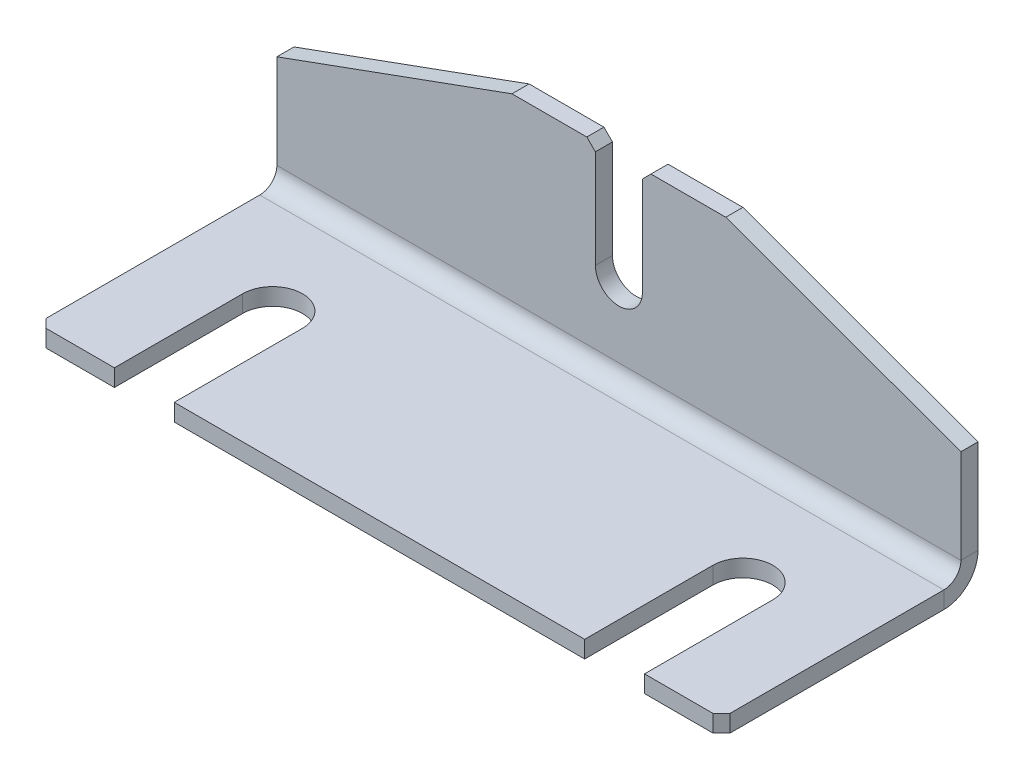
ISO-10303-21;
HEADER;
FILE_DESCRIPTION(('STEP AP214'),'2;1');
FILE_NAME('part.step','',(''),(''),'','','');
FILE_SCHEMA(('AUTOMOTIVE_DESIGN { 1 0 10303 214 1 1 1 1 }'));
ENDSEC;
DATA;
#1=APPLICATION_CONTEXT('core data for automotive mechanical design processes');
#2=APPLICATION_PROTOCOL_DEFINITION('international standard','automotive_design',2000,#1);
#3=PRODUCT_CONTEXT('',#1,'mechanical');
#4=PRODUCT('Part','Part','',(#3));
#5=PRODUCT_RELATED_PRODUCT_CATEGORY('part','',(#4));
#6=PRODUCT_DEFINITION_FORMATION('','',#4);
#7=PRODUCT_DEFINITION_CONTEXT('part definition',#1,'design');
#8=PRODUCT_DEFINITION('design','',#6,#7);
#9=PRODUCT_DEFINITION_SHAPE('','',#8);
#10=(LENGTH_UNIT() NAMED_UNIT(*) SI_UNIT(.MILLI.,.METRE.));
#11=(NAMED_UNIT(*) PLANE_ANGLE_UNIT() SI_UNIT($,.RADIAN.));
#12=(NAMED_UNIT(*) SI_UNIT($,.STERADIAN.) SOLID_ANGLE_UNIT());
#13=UNCERTAINTY_MEASURE_WITH_UNIT(LENGTH_MEASURE(1.E-05),#10,'distance_accuracy_value','');
#14=(GEOMETRIC_REPRESENTATION_CONTEXT(3) GLOBAL_UNCERTAINTY_ASSIGNED_CONTEXT((#13)) GLOBAL_UNIT_ASSIGNED_CONTEXT((#10,
#11,#12)) REPRESENTATION_CONTEXT('',''));
#15=CARTESIAN_POINT('',(0.,0.,0.));
#16=DIRECTION('',(0.,0.,1.));
#17=DIRECTION('',(1.,0.,0.));
#18=AXIS2_PLACEMENT_3D('',#15,#16,#17);
#19=CARTESIAN_POINT('',(-80.,46.,-30.0000000000002));
#20=DIRECTION('',(1.,0.,0.));
#21=DIRECTION('',(0.,0.,-1.));
#22=AXIS2_PLACEMENT_3D('',#19,#20,#21);
#23=PLANE('',#22);
#24=DIRECTION('',(0.,0.,1.));
#25=VECTOR('',#24,1.);
#26=CARTESIAN_POINT('',(-80.,26.,-30.0000000000002));
#27=LINE('',#26,#25);
#28=CARTESIAN_POINT('',(-80.,26.,-30.0000000000002));
#29=VERTEX_POINT('',#28);
#30=CARTESIAN_POINT('',(-80.,26.,-26.));
#31=VERTEX_POINT('',#30);
#32=EDGE_CURVE('E241',#29,#31,#27,.T.);
#33=ORIENTED_EDGE('',*,*,#32,.F.);
#34=DIRECTION('',(0.,1.,0.));
#35=VECTOR('',#34,1.);
#36=CARTESIAN_POINT('',(-80.,-1.18049333913981E-13,-30.));
#37=LINE('',#36,#35);
#38=CARTESIAN_POINT('',(-80.,4.00000000000002,-30.));
#39=VERTEX_POINT('',#38);
#40=EDGE_CURVE('E250',#39,#29,#37,.T.);
#41=ORIENTED_EDGE('',*,*,#40,.F.);
#42=DIRECTION('',(0.,0.,1.));
#43=VECTOR('',#42,1.);
#44=CARTESIAN_POINT('',(-80.,3.99999999999999,-26.));
#45=LINE('',#44,#43);
#46=CARTESIAN_POINT('',(-80.,3.99999999999995,-26.));
#47=VERTEX_POINT('',#46);
#48=EDGE_CURVE('E272',#47,#39,#45,.F.);
#49=ORIENTED_EDGE('',*,*,#48,.F.);
#50=DIRECTION('',(0.,-1.,0.));
#51=VECTOR('',#50,1.);
#52=CARTESIAN_POINT('',(-80.,46.,-26.0000000000002));
#53=LINE('',#52,#51);
#54=EDGE_CURVE('E266',#47,#31,#53,.F.);
#55=ORIENTED_EDGE('',*,*,#54,.T.);
#56=EDGE_LOOP('',(#33,#41,#49,#55));
#57=FACE_BOUND('',#56,.T.);
#58=ADVANCED_FACE('F61',(#57),#23,.F.);
#59=CARTESIAN_POINT('',(0.,-1.18049333913981E-13,-30.));
#60=DIRECTION('',(0.,0.,1.));
#61=DIRECTION('',(0.,-1.,0.));
#62=AXIS2_PLACEMENT_3D('',#59,#60,#61);
#63=PLANE('',#62);
#64=DIRECTION('',(1.,0.,0.));
#65=VECTOR('',#64,1.);
#66=CARTESIAN_POINT('',(0.,46.,-30.0000000000002));
#67=LINE('',#66,#65);
#68=CARTESIAN_POINT('',(-25.,46.,-30.0000000000002));
#69=VERTEX_POINT('',#68);
#70=CARTESIAN_POINT('',(-7.50000000000001,46.,-30.0000000000002));
#71=VERTEX_POINT('',#70);
#72=EDGE_CURVE('E246',#69,#71,#67,.T.);
#73=ORIENTED_EDGE('',*,*,#72,.T.);
#74=DIRECTION('',(0.707106781186546,-0.707106781186549,0.));
#75=VECTOR('',#74,1.);
#76=CARTESIAN_POINT('',(-5.5,44.,-30.0000000000003));
#77=LINE('',#76,#75);
#78=CARTESIAN_POINT('',(-5.5,44.,-30.0000000000002));
#79=VERTEX_POINT('',#78);
#80=EDGE_CURVE('E13',#71,#79,#77,.T.);
#81=ORIENTED_EDGE('',*,*,#80,.T.);
#82=DIRECTION('',(0.,1.,0.));
#83=VECTOR('',#82,1.);
#84=CARTESIAN_POINT('',(-5.5,0.,-30.0000000000002));
#85=LINE('',#84,#83);
#86=CARTESIAN_POINT('',(-5.5,21.,-30.0000000000002));
#87=VERTEX_POINT('',#86);
#88=EDGE_CURVE('E413',#87,#79,#85,.T.);
#89=ORIENTED_EDGE('',*,*,#88,.F.);
#90=CARTESIAN_POINT('',(0.,21.,-30.0000000000002));
#91=DIRECTION('',(0.,0.,1.));
#92=DIRECTION('',(1.,0.,0.));
#93=AXIS2_PLACEMENT_3D('',#90,#91,#92);
#94=CIRCLE('',#93,5.5);
#95=CARTESIAN_POINT('',(5.5,21.,-30.0000000000002));
#96=VERTEX_POINT('',#95);
#97=EDGE_CURVE('E527',#87,#96,#94,.T.);
#98=ORIENTED_EDGE('',*,*,#97,.T.);
#99=DIRECTION('',(0.,1.,0.));
#100=VECTOR('',#99,1.);
#101=CARTESIAN_POINT('',(5.5,0.,-30.0000000000002));
#102=LINE('',#101,#100);
#103=CARTESIAN_POINT('',(5.5,44.,-30.0000000000002));
#104=VERTEX_POINT('',#103);
#105=EDGE_CURVE('E427',#96,#104,#102,.T.);
#106=ORIENTED_EDGE('',*,*,#105,.T.);
#107=DIRECTION('',(-0.707106781186546,-0.707106781186549,0.));
#108=VECTOR('',#107,1.);
#109=CARTESIAN_POINT('',(7.50000000000001,46.,-30.0000000000002));
#110=LINE('',#109,#108);
#111=CARTESIAN_POINT('',(7.50000000000001,46.,-30.0000000000002));
#112=VERTEX_POINT('',#111);
#113=EDGE_CURVE('E400',#104,#112,#110,.F.);
#114=ORIENTED_EDGE('',*,*,#113,.T.);
#115=CARTESIAN_POINT('',(25.,46.,-30.0000000000002));
#116=VERTEX_POINT('',#115);
#117=EDGE_CURVE('E254',#112,#116,#67,.T.);
#118=ORIENTED_EDGE('',*,*,#117,.T.);
#119=DIRECTION('',(0.939793423488437,-0.341743063086704,0.));
#120=VECTOR('',#119,1.);
#121=CARTESIAN_POINT('',(17.6934306569343,48.6569343065693,-30.0000000000002));
#122=LINE('',#121,#120);
#123=CARTESIAN_POINT('',(80.,26.,-30.0000000000002));
#124=VERTEX_POINT('',#123);
#125=EDGE_CURVE('E436',#116,#124,#122,.T.);
#126=ORIENTED_EDGE('',*,*,#125,.T.);
#127=DIRECTION('',(0.,-1.,0.));
#128=VECTOR('',#127,1.);
#129=CARTESIAN_POINT('',(80.,-1.18049333913981E-13,-30.));
#130=LINE('',#129,#128);
#131=CARTESIAN_POINT('',(80.,3.99999999999993,-30.));
#132=VERTEX_POINT('',#131);
#133=EDGE_CURVE('E253',#124,#132,#130,.T.);
#134=ORIENTED_EDGE('',*,*,#133,.T.);
#135=DIRECTION('',(-1.,0.,0.));
#136=VECTOR('',#135,1.);
#137=CARTESIAN_POINT('',(80.,4.00000000000001,-30.));
#138=LINE('',#137,#136);
#139=EDGE_CURVE('E269',#39,#132,#138,.F.);
#140=ORIENTED_EDGE('',*,*,#139,.F.);
#141=ORIENTED_EDGE('',*,*,#40,.T.);
#142=DIRECTION('',(-0.939793423488437,-0.341743063086704,0.));
#143=VECTOR('',#142,1.);
#144=CARTESIAN_POINT('',(-17.6934306569343,48.6569343065693,-30.0000000000002));
#145=LINE('',#144,#143);
#146=EDGE_CURVE('E237',#69,#29,#145,.T.);
#147=ORIENTED_EDGE('',*,*,#146,.F.);
#148=EDGE_LOOP('',(#73,#81,#89,#98,#106,#114,#118,#126,#134,#140,#141,#147));
#149=FACE_BOUND('',#148,.T.);
#150=ADVANCED_FACE('F245',(#149),#63,.F.);
#151=CARTESIAN_POINT('',(0.,-1.04083408558608E-13,-26.));
#152=DIRECTION('',(0.,0.,1.));
#153=DIRECTION('',(0.,-1.,0.));
#154=AXIS2_PLACEMENT_3D('',#151,#152,#153);
#155=PLANE('',#154);
#156=DIRECTION('',(0.,1.,0.));
#157=VECTOR('',#156,1.);
#158=CARTESIAN_POINT('',(-5.5,0.,-26.));
#159=LINE('',#158,#157);
#160=CARTESIAN_POINT('',(-5.5,21.,-26.));
#161=VERTEX_POINT('',#160);
#162=CARTESIAN_POINT('',(-5.5,44.,-26.));
#163=VERTEX_POINT('',#162);
#164=EDGE_CURVE('E410',#161,#163,#159,.T.);
#165=ORIENTED_EDGE('',*,*,#164,.T.);
#166=DIRECTION('',(-0.707106781186546,0.707106781186549,0.));
#167=VECTOR('',#166,1.);
#168=CARTESIAN_POINT('',(19.25,19.2499999999998,-26.0000000000001));
#169=LINE('',#168,#167);
#170=CARTESIAN_POINT('',(-7.50000000000001,46.,-26.0000000000002));
#171=VERTEX_POINT('',#170);
#172=EDGE_CURVE('E84',#163,#171,#169,.T.);
#173=ORIENTED_EDGE('',*,*,#172,.T.);
#174=DIRECTION('',(-1.,0.,0.));
#175=VECTOR('',#174,1.);
#176=CARTESIAN_POINT('',(80.,46.,-26.0000000000002));
#177=LINE('',#176,#175);
#178=CARTESIAN_POINT('',(-25.,46.,-26.0000000000002));
#179=VERTEX_POINT('',#178);
#180=EDGE_CURVE('E263',#179,#171,#177,.F.);
#181=ORIENTED_EDGE('',*,*,#180,.F.);
#182=DIRECTION('',(-0.939793423488437,-0.341743063086704,0.));
#183=VECTOR('',#182,1.);
#184=CARTESIAN_POINT('',(-17.6934306569343,48.6569343065693,-26.));
#185=LINE('',#184,#183);
#186=EDGE_CURVE('E240',#179,#31,#185,.T.);
#187=ORIENTED_EDGE('',*,*,#186,.T.);
#188=ORIENTED_EDGE('',*,*,#54,.F.);
#189=DIRECTION('',(-1.,0.,0.));
#190=VECTOR('',#189,1.);
#191=CARTESIAN_POINT('',(80.,3.99999999999999,-26.));
#192=LINE('',#191,#190);
#193=CARTESIAN_POINT('',(80.,3.99999999999995,-26.));
#194=VERTEX_POINT('',#193);
#195=EDGE_CURVE('E275',#194,#47,#192,.T.);
#196=ORIENTED_EDGE('',*,*,#195,.F.);
#197=DIRECTION('',(0.,1.,0.));
#198=VECTOR('',#197,1.);
#199=CARTESIAN_POINT('',(80.,0.,-26.));
#200=LINE('',#199,#198);
#201=CARTESIAN_POINT('',(80.,26.,-26.));
#202=VERTEX_POINT('',#201);
#203=EDGE_CURVE('E261',#202,#194,#200,.F.);
#204=ORIENTED_EDGE('',*,*,#203,.F.);
#205=DIRECTION('',(0.939793423488437,-0.341743063086704,0.));
#206=VECTOR('',#205,1.);
#207=CARTESIAN_POINT('',(17.6934306569343,48.6569343065693,-26.));
#208=LINE('',#207,#206);
#209=CARTESIAN_POINT('',(25.,46.,-26.));
#210=VERTEX_POINT('',#209);
#211=EDGE_CURVE('E439',#210,#202,#208,.T.);
#212=ORIENTED_EDGE('',*,*,#211,.F.);
#213=CARTESIAN_POINT('',(7.50000000000001,46.,-26.0000000000002));
#214=VERTEX_POINT('',#213);
#215=EDGE_CURVE('E264',#214,#210,#177,.F.);
#216=ORIENTED_EDGE('',*,*,#215,.F.);
#217=DIRECTION('',(0.707106781186546,0.707106781186549,0.));
#218=VECTOR('',#217,1.);
#219=CARTESIAN_POINT('',(-19.25,19.2499999999998,-26.0000000000001));
#220=LINE('',#219,#218);
#221=CARTESIAN_POINT('',(5.5,44.,-26.));
#222=VERTEX_POINT('',#221);
#223=EDGE_CURVE('E396',#214,#222,#220,.F.);
#224=ORIENTED_EDGE('',*,*,#223,.T.);
#225=DIRECTION('',(0.,1.,0.));
#226=VECTOR('',#225,1.);
#227=CARTESIAN_POINT('',(5.5,0.,-26.));
#228=LINE('',#227,#226);
#229=CARTESIAN_POINT('',(5.5,21.,-26.));
#230=VERTEX_POINT('',#229);
#231=EDGE_CURVE('E421',#230,#222,#228,.T.);
#232=ORIENTED_EDGE('',*,*,#231,.F.);
#233=CARTESIAN_POINT('',(0.,21.,-26.));
#234=DIRECTION('',(0.,0.,1.));
#235=DIRECTION('',(1.,0.,0.));
#236=AXIS2_PLACEMENT_3D('',#233,#234,#235);
#237=CIRCLE('',#236,5.5);
#238=EDGE_CURVE('E418',#161,#230,#237,.T.);
#239=ORIENTED_EDGE('',*,*,#238,.F.);
#240=EDGE_LOOP('',(#165,#173,#181,#187,#188,#196,#204,#212,#216,#224,#232,#239));
#241=FACE_BOUND('',#240,.T.);
#242=ADVANCED_FACE('F415',(#241),#155,.T.);
#243=CARTESIAN_POINT('',(80.,46.,-30.0000000000002));
#244=DIRECTION('',(0.,-1.,0.));
#245=DIRECTION('',(0.,0.,-1.));
#246=AXIS2_PLACEMENT_3D('',#243,#244,#245);
#247=PLANE('',#246);
#248=ORIENTED_EDGE('',*,*,#180,.T.);
#249=DIRECTION('',(0.,0.,-1.));
#250=VECTOR('',#249,1.);
#251=CARTESIAN_POINT('',(-7.50000000000001,46.,-30.0000000000002));
#252=LINE('',#251,#250);
#253=EDGE_CURVE('E70',#171,#71,#252,.T.);
#254=ORIENTED_EDGE('',*,*,#253,.T.);
#255=ORIENTED_EDGE('',*,*,#72,.F.);
#256=DIRECTION('',(0.,0.,1.));
#257=VECTOR('',#256,1.);
#258=CARTESIAN_POINT('',(-25.,46.,-30.0000000000002));
#259=LINE('',#258,#257);
#260=EDGE_CURVE('E234',#69,#179,#259,.T.);
#261=ORIENTED_EDGE('',*,*,#260,.T.);
#262=EDGE_LOOP('',(#248,#254,#255,#261));
#263=FACE_BOUND('',#262,.T.);
#264=ADVANCED_FACE('F252',(#263),#247,.F.);
#265=CARTESIAN_POINT('',(-80.,-4.,30.));
#266=DIRECTION('',(-1.,0.,0.));
#267=DIRECTION('',(0.,0.,1.));
#268=AXIS2_PLACEMENT_3D('',#265,#266,#267);
#269=PLANE('',#268);
#270=DIRECTION('',(0.,0.,1.));
#271=VECTOR('',#270,1.);
#272=CARTESIAN_POINT('',(-80.,0.,30.));
#273=LINE('',#272,#271);
#274=CARTESIAN_POINT('',(-80.,0.,-22.));
#275=VERTEX_POINT('',#274);
#276=CARTESIAN_POINT('',(-80.,0.,28.));
#277=VERTEX_POINT('',#276);
#278=EDGE_CURVE('E364',#275,#277,#273,.T.);
#279=ORIENTED_EDGE('',*,*,#278,.F.);
#280=DIRECTION('',(0.,-1.,0.));
#281=VECTOR('',#280,1.);
#282=CARTESIAN_POINT('',(-80.,0.,-22.));
#283=LINE('',#282,#281);
#284=CARTESIAN_POINT('',(-80.,-4.00000000000004,-22.));
#285=VERTEX_POINT('',#284);
#286=EDGE_CURVE('E287',#275,#285,#283,.T.);
#287=ORIENTED_EDGE('',*,*,#286,.T.);
#288=DIRECTION('',(0.,0.,1.));
#289=VECTOR('',#288,1.);
#290=CARTESIAN_POINT('',(-80.,-4.,30.));
#291=LINE('',#290,#289);
#292=CARTESIAN_POINT('',(-80.,-4.,28.));
#293=VERTEX_POINT('',#292);
#294=EDGE_CURVE('E354',#285,#293,#291,.T.);
#295=ORIENTED_EDGE('',*,*,#294,.T.);
#296=DIRECTION('',(0.,1.,0.));
#297=VECTOR('',#296,1.);
#298=CARTESIAN_POINT('',(-80.,-4.,28.));
#299=LINE('',#298,#297);
#300=EDGE_CURVE('E374',#293,#277,#299,.T.);
#301=ORIENTED_EDGE('',*,*,#300,.T.);
#302=EDGE_LOOP('',(#279,#287,#295,#301));
#303=FACE_BOUND('',#302,.T.);
#304=ADVANCED_FACE('F470',(#303),#269,.T.);
#305=CARTESIAN_POINT('',(0.,-4.,0.));
#306=DIRECTION('',(0.,-1.,0.));
#307=DIRECTION('',(0.,0.,-1.));
#308=AXIS2_PLACEMENT_3D('',#305,#306,#307);
#309=PLANE('',#308);
#310=ORIENTED_EDGE('',*,*,#294,.F.);
#311=DIRECTION('',(-1.,0.,0.));
#312=VECTOR('',#311,1.);
#313=CARTESIAN_POINT('',(-80.,-4.00000000000004,-22.));
#314=LINE('',#313,#312);
#315=CARTESIAN_POINT('',(80.,-4.,-22.));
#316=VERTEX_POINT('',#315);
#317=EDGE_CURVE('E280',#285,#316,#314,.F.);
#318=ORIENTED_EDGE('',*,*,#317,.T.);
#319=DIRECTION('',(0.,0.,-1.));
#320=VECTOR('',#319,1.);
#321=CARTESIAN_POINT('',(80.,-4.,30.));
#322=LINE('',#321,#320);
#323=CARTESIAN_POINT('',(80.,-4.,28.));
#324=VERTEX_POINT('',#323);
#325=EDGE_CURVE('E351',#324,#316,#322,.T.);
#326=ORIENTED_EDGE('',*,*,#325,.F.);
#327=DIRECTION('',(0.707106781186551,0.,-0.707106781186544));
#328=VECTOR('',#327,1.);
#329=CARTESIAN_POINT('',(53.9999999999996,-4.,54.0000000000001));
#330=LINE('',#329,#328);
#331=CARTESIAN_POINT('',(78.,-4.,30.));
#332=VERTEX_POINT('',#331);
#333=EDGE_CURVE('E391',#324,#332,#330,.F.);
#334=ORIENTED_EDGE('',*,*,#333,.T.);
#335=DIRECTION('',(1.,0.,0.));
#336=VECTOR('',#335,1.);
#337=CARTESIAN_POINT('',(-80.,-4.,30.));
#338=LINE('',#337,#336);
#339=CARTESIAN_POINT('',(62.,-4.,30.));
#340=VERTEX_POINT('',#339);
#341=EDGE_CURVE('E357',#340,#332,#338,.T.);
#342=ORIENTED_EDGE('',*,*,#341,.F.);
#343=DIRECTION('',(0.,0.,-1.));
#344=VECTOR('',#343,1.);
#345=CARTESIAN_POINT('',(62.,-4.,31.4054771623982));
#346=LINE('',#345,#344);
#347=CARTESIAN_POINT('',(62.,-4.,0.));
#348=VERTEX_POINT('',#347);
#349=EDGE_CURVE('E332',#340,#348,#346,.T.);
#350=ORIENTED_EDGE('',*,*,#349,.T.);
#351=CARTESIAN_POINT('',(55.,-4.,0.));
#352=DIRECTION('',(0.,1.,0.));
#353=DIRECTION('',(0.,0.,-1.));
#354=AXIS2_PLACEMENT_3D('',#351,#352,#353);
#355=CIRCLE('',#354,7.);
#356=CARTESIAN_POINT('',(48.,-4.,0.));
#357=VERTEX_POINT('',#356);
#358=EDGE_CURVE('E325',#348,#357,#355,.T.);
#359=ORIENTED_EDGE('',*,*,#358,.T.);
#360=DIRECTION('',(0.,0.,1.));
#361=VECTOR('',#360,1.);
#362=CARTESIAN_POINT('',(48.,-4.,0.));
#363=LINE('',#362,#361);
#364=CARTESIAN_POINT('',(48.,-4.,30.));
#365=VERTEX_POINT('',#364);
#366=EDGE_CURVE('E328',#357,#365,#363,.T.);
#367=ORIENTED_EDGE('',*,*,#366,.T.);
#368=CARTESIAN_POINT('',(-48.,-4.,30.));
#369=VERTEX_POINT('',#368);
#370=EDGE_CURVE('E361',#369,#365,#338,.T.);
#371=ORIENTED_EDGE('',*,*,#370,.F.);
#372=DIRECTION('',(0.,0.,-1.));
#373=VECTOR('',#372,1.);
#374=CARTESIAN_POINT('',(-48.,-4.,0.));
#375=LINE('',#374,#373);
#376=CARTESIAN_POINT('',(-48.,-4.,0.));
#377=VERTEX_POINT('',#376);
#378=EDGE_CURVE('E310',#369,#377,#375,.T.);
#379=ORIENTED_EDGE('',*,*,#378,.T.);
#380=CARTESIAN_POINT('',(-55.,-4.,0.));
#381=DIRECTION('',(0.,1.,0.));
#382=DIRECTION('',(0.,0.,1.));
#383=AXIS2_PLACEMENT_3D('',#380,#381,#382);
#384=CIRCLE('',#383,7.);
#385=CARTESIAN_POINT('',(-62.,-4.,0.));
#386=VERTEX_POINT('',#385);
#387=EDGE_CURVE('E303',#377,#386,#384,.T.);
#388=ORIENTED_EDGE('',*,*,#387,.T.);
#389=DIRECTION('',(0.,0.,1.));
#390=VECTOR('',#389,1.);
#391=CARTESIAN_POINT('',(-62.,-4.,31.4054771623982));
#392=LINE('',#391,#390);
#393=CARTESIAN_POINT('',(-62.,-4.,30.));
#394=VERTEX_POINT('',#393);
#395=EDGE_CURVE('E306',#386,#394,#392,.T.);
#396=ORIENTED_EDGE('',*,*,#395,.T.);
#397=CARTESIAN_POINT('',(-78.,-4.,30.));
#398=VERTEX_POINT('',#397);
#399=EDGE_CURVE('E358',#398,#394,#338,.T.);
#400=ORIENTED_EDGE('',*,*,#399,.F.);
#401=DIRECTION('',(0.707106781186548,0.,0.707106781186547));
#402=VECTOR('',#401,1.);
#403=CARTESIAN_POINT('',(-53.9999999999999,-4.,54.));
#404=LINE('',#403,#402);
#405=EDGE_CURVE('E381',#398,#293,#404,.F.);
#406=ORIENTED_EDGE('',*,*,#405,.T.);
#407=EDGE_LOOP('',(#310,#318,#326,#334,#342,#350,#359,#367,#371,#379,#388,#396,#400,#406));
#408=FACE_BOUND('',#407,.T.);
#409=ADVANCED_FACE('F487',(#408),#309,.T.);
#410=CARTESIAN_POINT('',(0.,0.,0.));
#411=DIRECTION('',(0.,-1.,0.));
#412=DIRECTION('',(0.,0.,-1.));
#413=AXIS2_PLACEMENT_3D('',#410,#411,#412);
#414=PLANE('',#413);
#415=DIRECTION('',(-1.,0.,0.));
#416=VECTOR('',#415,1.);
#417=CARTESIAN_POINT('',(-80.,0.,-22.));
#418=LINE('',#417,#416);
#419=CARTESIAN_POINT('',(80.,0.,-22.));
#420=VERTEX_POINT('',#419);
#421=EDGE_CURVE('E293',#275,#420,#418,.F.);
#422=ORIENTED_EDGE('',*,*,#421,.F.);
#423=ORIENTED_EDGE('',*,*,#278,.T.);
#424=DIRECTION('',(-0.707106781186548,0.,-0.707106781186547));
#425=VECTOR('',#424,1.);
#426=CARTESIAN_POINT('',(-80.,0.,28.));
#427=LINE('',#426,#425);
#428=CARTESIAN_POINT('',(-78.,0.,30.));
#429=VERTEX_POINT('',#428);
#430=EDGE_CURVE('E377',#277,#429,#427,.F.);
#431=ORIENTED_EDGE('',*,*,#430,.T.);
#432=DIRECTION('',(1.,0.,0.));
#433=VECTOR('',#432,1.);
#434=CARTESIAN_POINT('',(-80.,0.,30.));
#435=LINE('',#434,#433);
#436=CARTESIAN_POINT('',(-62.,0.,30.));
#437=VERTEX_POINT('',#436);
#438=EDGE_CURVE('E355',#429,#437,#435,.T.);
#439=ORIENTED_EDGE('',*,*,#438,.T.);
#440=DIRECTION('',(0.,0.,1.));
#441=VECTOR('',#440,1.);
#442=CARTESIAN_POINT('',(-62.,0.,31.4054771623982));
#443=LINE('',#442,#441);
#444=CARTESIAN_POINT('',(-62.,0.,0.));
#445=VERTEX_POINT('',#444);
#446=EDGE_CURVE('E307',#445,#437,#443,.T.);
#447=ORIENTED_EDGE('',*,*,#446,.F.);
#448=CARTESIAN_POINT('',(-55.,0.,0.));
#449=DIRECTION('',(0.,1.,0.));
#450=DIRECTION('',(0.,0.,1.));
#451=AXIS2_PLACEMENT_3D('',#448,#449,#450);
#452=CIRCLE('',#451,7.);
#453=CARTESIAN_POINT('',(-48.,0.,0.));
#454=VERTEX_POINT('',#453);
#455=EDGE_CURVE('E314',#454,#445,#452,.T.);
#456=ORIENTED_EDGE('',*,*,#455,.F.);
#457=DIRECTION('',(0.,0.,1.));
#458=VECTOR('',#457,1.);
#459=CARTESIAN_POINT('',(-48.,0.,0.));
#460=LINE('',#459,#458);
#461=CARTESIAN_POINT('',(-48.,0.,30.));
#462=VERTEX_POINT('',#461);
#463=EDGE_CURVE('E371',#454,#462,#460,.T.);
#464=ORIENTED_EDGE('',*,*,#463,.T.);
#465=CARTESIAN_POINT('',(48.,0.,30.));
#466=VERTEX_POINT('',#465);
#467=EDGE_CURVE('E368',#462,#466,#435,.T.);
#468=ORIENTED_EDGE('',*,*,#467,.T.);
#469=DIRECTION('',(0.,0.,1.));
#470=VECTOR('',#469,1.);
#471=CARTESIAN_POINT('',(48.,0.,0.));
#472=LINE('',#471,#470);
#473=CARTESIAN_POINT('',(48.,0.,0.));
#474=VERTEX_POINT('',#473);
#475=EDGE_CURVE('E329',#474,#466,#472,.T.);
#476=ORIENTED_EDGE('',*,*,#475,.F.);
#477=CARTESIAN_POINT('',(55.,0.,0.));
#478=DIRECTION('',(0.,1.,0.));
#479=DIRECTION('',(0.,0.,-1.));
#480=AXIS2_PLACEMENT_3D('',#477,#478,#479);
#481=CIRCLE('',#480,7.);
#482=CARTESIAN_POINT('',(62.,0.,0.));
#483=VERTEX_POINT('',#482);
#484=EDGE_CURVE('E300',#483,#474,#481,.T.);
#485=ORIENTED_EDGE('',*,*,#484,.F.);
#486=DIRECTION('',(0.,0.,1.));
#487=VECTOR('',#486,1.);
#488=CARTESIAN_POINT('',(62.,0.,0.));
#489=LINE('',#488,#487);
#490=CARTESIAN_POINT('',(62.,0.,30.));
#491=VERTEX_POINT('',#490);
#492=EDGE_CURVE('E360',#483,#491,#489,.T.);
#493=ORIENTED_EDGE('',*,*,#492,.T.);
#494=CARTESIAN_POINT('',(78.,0.,30.));
#495=VERTEX_POINT('',#494);
#496=EDGE_CURVE('E366',#491,#495,#435,.T.);
#497=ORIENTED_EDGE('',*,*,#496,.T.);
#498=DIRECTION('',(-0.707106781186551,0.,0.707106781186544));
#499=VECTOR('',#498,1.);
#500=CARTESIAN_POINT('',(78.,0.,30.));
#501=LINE('',#500,#499);
#502=CARTESIAN_POINT('',(80.,0.,28.));
#503=VERTEX_POINT('',#502);
#504=EDGE_CURVE('E387',#495,#503,#501,.F.);
#505=ORIENTED_EDGE('',*,*,#504,.T.);
#506=DIRECTION('',(0.,0.,-1.));
#507=VECTOR('',#506,1.);
#508=CARTESIAN_POINT('',(80.,0.,30.));
#509=LINE('',#508,#507);
#510=EDGE_CURVE('E350',#503,#420,#509,.T.);
#511=ORIENTED_EDGE('',*,*,#510,.T.);
#512=EDGE_LOOP('',(#422,#423,#431,#439,#447,#456,#464,#468,#476,#485,#493,#497,#505,#511));
#513=FACE_BOUND('',#512,.T.);
#514=ADVANCED_FACE('F465',(#513),#414,.F.);
#515=CARTESIAN_POINT('',(-80.,-4.,30.));
#516=DIRECTION('',(0.,0.,1.));
#517=DIRECTION('',(1.,0.,0.));
#518=AXIS2_PLACEMENT_3D('',#515,#516,#517);
#519=PLANE('',#518);
#520=DIRECTION('',(0.,1.,0.));
#521=VECTOR('',#520,1.);
#522=CARTESIAN_POINT('',(-48.,-4.,30.));
#523=LINE('',#522,#521);
#524=EDGE_CURVE('E348',#369,#462,#523,.T.);
#525=ORIENTED_EDGE('',*,*,#524,.F.);
#526=ORIENTED_EDGE('',*,*,#370,.T.);
#527=DIRECTION('',(0.,-1.,0.));
#528=VECTOR('',#527,1.);
#529=CARTESIAN_POINT('',(48.,-4.,30.));
#530=LINE('',#529,#528);
#531=EDGE_CURVE('E322',#466,#365,#530,.T.);
#532=ORIENTED_EDGE('',*,*,#531,.F.);
#533=ORIENTED_EDGE('',*,*,#467,.F.);
#534=EDGE_LOOP('',(#525,#526,#532,#533));
#535=FACE_BOUND('',#534,.T.);
#536=ADVANCED_FACE('F500',(#535),#519,.T.);
#537=ORIENTED_EDGE('',*,*,#341,.T.);
#538=DIRECTION('',(0.,1.,0.));
#539=VECTOR('',#538,1.);
#540=CARTESIAN_POINT('',(78.,-4.,30.));
#541=LINE('',#540,#539);
#542=EDGE_CURVE('E384',#332,#495,#541,.T.);
#543=ORIENTED_EDGE('',*,*,#542,.T.);
#544=ORIENTED_EDGE('',*,*,#496,.F.);
#545=DIRECTION('',(0.,1.,0.));
#546=VECTOR('',#545,1.);
#547=CARTESIAN_POINT('',(62.,-4.,30.));
#548=LINE('',#547,#546);
#549=EDGE_CURVE('E343',#340,#491,#548,.T.);
#550=ORIENTED_EDGE('',*,*,#549,.F.);
#551=EDGE_LOOP('',(#537,#543,#544,#550));
#552=FACE_BOUND('',#551,.T.);
#553=ADVANCED_FACE('F508',(#552),#519,.T.);
#554=CARTESIAN_POINT('',(80.,-4.,30.));
#555=DIRECTION('',(1.,0.,0.));
#556=DIRECTION('',(0.,0.,-1.));
#557=AXIS2_PLACEMENT_3D('',#554,#555,#556);
#558=PLANE('',#557);
#559=DIRECTION('',(0.,-1.,0.));
#560=VECTOR('',#559,1.);
#561=CARTESIAN_POINT('',(80.,0.,-22.));
#562=LINE('',#561,#560);
#563=EDGE_CURVE('E297',#420,#316,#562,.T.);
#564=ORIENTED_EDGE('',*,*,#563,.F.);
#565=ORIENTED_EDGE('',*,*,#510,.F.);
#566=DIRECTION('',(0.,-1.,0.));
#567=VECTOR('',#566,1.);
#568=CARTESIAN_POINT('',(80.,-4.,28.));
#569=LINE('',#568,#567);
#570=EDGE_CURVE('E389',#503,#324,#569,.T.);
#571=ORIENTED_EDGE('',*,*,#570,.T.);
#572=ORIENTED_EDGE('',*,*,#325,.T.);
#573=EDGE_LOOP('',(#564,#565,#571,#572));
#574=FACE_BOUND('',#573,.T.);
#575=ADVANCED_FACE('F517',(#574),#558,.T.);
#576=ORIENTED_EDGE('',*,*,#438,.F.);
#577=DIRECTION('',(0.,-1.,0.));
#578=VECTOR('',#577,1.);
#579=CARTESIAN_POINT('',(-78.,-4.,30.));
#580=LINE('',#579,#578);
#581=EDGE_CURVE('E379',#429,#398,#580,.T.);
#582=ORIENTED_EDGE('',*,*,#581,.T.);
#583=ORIENTED_EDGE('',*,*,#399,.T.);
#584=DIRECTION('',(0.,-1.,0.));
#585=VECTOR('',#584,1.);
#586=CARTESIAN_POINT('',(-62.,-4.,30.));
#587=LINE('',#586,#585);
#588=EDGE_CURVE('E345',#437,#394,#587,.T.);
#589=ORIENTED_EDGE('',*,*,#588,.F.);
#590=EDGE_LOOP('',(#576,#582,#583,#589));
#591=FACE_BOUND('',#590,.T.);
#592=ADVANCED_FACE('F481',(#591),#519,.T.);
#593=CARTESIAN_POINT('',(55.,-4.,0.));
#594=DIRECTION('',(0.,1.,0.));
#595=DIRECTION('',(0.,0.,1.));
#596=AXIS2_PLACEMENT_3D('',#593,#594,#595);
#597=CYLINDRICAL_SURFACE('',#596,7.);
#598=ORIENTED_EDGE('',*,*,#484,.T.);
#599=DIRECTION('',(0.,1.,0.));
#600=VECTOR('',#599,1.);
#601=CARTESIAN_POINT('',(48.,-4.,0.));
#602=LINE('',#601,#600);
#603=EDGE_CURVE('E335',#357,#474,#602,.T.);
#604=ORIENTED_EDGE('',*,*,#603,.F.);
#605=ORIENTED_EDGE('',*,*,#358,.F.);
#606=DIRECTION('',(0.,1.,0.));
#607=VECTOR('',#606,1.);
#608=CARTESIAN_POINT('',(62.,-4.,0.));
#609=LINE('',#608,#607);
#610=EDGE_CURVE('E316',#348,#483,#609,.T.);
#611=ORIENTED_EDGE('',*,*,#610,.T.);
#612=EDGE_LOOP('',(#598,#604,#605,#611));
#613=FACE_BOUND('',#612,.T.);
#614=ADVANCED_FACE('F575',(#613),#597,.F.);
#615=CARTESIAN_POINT('',(62.,-4.,31.4054771623982));
#616=DIRECTION('',(1.,0.,0.));
#617=DIRECTION('',(0.,0.,-1.));
#618=AXIS2_PLACEMENT_3D('',#615,#616,#617);
#619=PLANE('',#618);
#620=ORIENTED_EDGE('',*,*,#549,.T.);
#621=ORIENTED_EDGE('',*,*,#492,.F.);
#622=ORIENTED_EDGE('',*,*,#610,.F.);
#623=ORIENTED_EDGE('',*,*,#349,.F.);
#624=EDGE_LOOP('',(#620,#621,#622,#623));
#625=FACE_BOUND('',#624,.T.);
#626=ADVANCED_FACE('F572',(#625),#619,.F.);
#627=CARTESIAN_POINT('',(48.,-4.,0.));
#628=DIRECTION('',(-1.,0.,0.));
#629=DIRECTION('',(0.,0.,1.));
#630=AXIS2_PLACEMENT_3D('',#627,#628,#629);
#631=PLANE('',#630);
#632=ORIENTED_EDGE('',*,*,#531,.T.);
#633=ORIENTED_EDGE('',*,*,#366,.F.);
#634=ORIENTED_EDGE('',*,*,#603,.T.);
#635=ORIENTED_EDGE('',*,*,#475,.T.);
#636=EDGE_LOOP('',(#632,#633,#634,#635));
#637=FACE_BOUND('',#636,.T.);
#638=ADVANCED_FACE('F571',(#637),#631,.F.);
#639=CARTESIAN_POINT('',(-55.,-4.,0.));
#640=DIRECTION('',(0.,1.,0.));
#641=DIRECTION('',(0.,0.,1.));
#642=AXIS2_PLACEMENT_3D('',#639,#640,#641);
#643=CYLINDRICAL_SURFACE('',#642,7.);
#644=ORIENTED_EDGE('',*,*,#455,.T.);
#645=DIRECTION('',(0.,1.,0.));
#646=VECTOR('',#645,1.);
#647=CARTESIAN_POINT('',(-62.,-4.,0.));
#648=LINE('',#647,#646);
#649=EDGE_CURVE('E313',#386,#445,#648,.T.);
#650=ORIENTED_EDGE('',*,*,#649,.F.);
#651=ORIENTED_EDGE('',*,*,#387,.F.);
#652=DIRECTION('',(0.,1.,0.));
#653=VECTOR('',#652,1.);
#654=CARTESIAN_POINT('',(-48.,-4.,0.));
#655=LINE('',#654,#653);
#656=EDGE_CURVE('E319',#377,#454,#655,.T.);
#657=ORIENTED_EDGE('',*,*,#656,.T.);
#658=EDGE_LOOP('',(#644,#650,#651,#657));
#659=FACE_BOUND('',#658,.T.);
#660=ADVANCED_FACE('F491',(#659),#643,.F.);
#661=CARTESIAN_POINT('',(-48.,-4.,0.));
#662=DIRECTION('',(1.,0.,0.));
#663=DIRECTION('',(0.,0.,-1.));
#664=AXIS2_PLACEMENT_3D('',#661,#662,#663);
#665=PLANE('',#664);
#666=ORIENTED_EDGE('',*,*,#524,.T.);
#667=ORIENTED_EDGE('',*,*,#463,.F.);
#668=ORIENTED_EDGE('',*,*,#656,.F.);
#669=ORIENTED_EDGE('',*,*,#378,.F.);
#670=EDGE_LOOP('',(#666,#667,#668,#669));
#671=FACE_BOUND('',#670,.T.);
#672=ADVANCED_FACE('F564',(#671),#665,.F.);
#673=CARTESIAN_POINT('',(-62.,-4.,31.4054771623982));
#674=DIRECTION('',(-1.,0.,0.));
#675=DIRECTION('',(0.,0.,1.));
#676=AXIS2_PLACEMENT_3D('',#673,#674,#675);
#677=PLANE('',#676);
#678=ORIENTED_EDGE('',*,*,#588,.T.);
#679=ORIENTED_EDGE('',*,*,#395,.F.);
#680=ORIENTED_EDGE('',*,*,#649,.T.);
#681=ORIENTED_EDGE('',*,*,#446,.T.);
#682=EDGE_LOOP('',(#678,#679,#680,#681));
#683=FACE_BOUND('',#682,.T.);
#684=ADVANCED_FACE('F485',(#683),#677,.F.);
#685=CARTESIAN_POINT('',(-80.,-4.,28.));
#686=DIRECTION('',(0.707106781186547,0.,-0.707106781186548));
#687=DIRECTION('',(0.,1.,0.));
#688=AXIS2_PLACEMENT_3D('',#685,#686,#687);
#689=PLANE('',#688);
#690=ORIENTED_EDGE('',*,*,#405,.F.);
#691=ORIENTED_EDGE('',*,*,#581,.F.);
#692=ORIENTED_EDGE('',*,*,#430,.F.);
#693=ORIENTED_EDGE('',*,*,#300,.F.);
#694=EDGE_LOOP('',(#690,#691,#692,#693));
#695=FACE_BOUND('',#694,.T.);
#696=ADVANCED_FACE('F475',(#695),#689,.F.);
#697=CARTESIAN_POINT('',(78.,-4.,30.));
#698=DIRECTION('',(-0.707106781186544,0.,-0.707106781186551));
#699=DIRECTION('',(0.,1.,0.));
#700=AXIS2_PLACEMENT_3D('',#697,#698,#699);
#701=PLANE('',#700);
#702=ORIENTED_EDGE('',*,*,#333,.F.);
#703=ORIENTED_EDGE('',*,*,#570,.F.);
#704=ORIENTED_EDGE('',*,*,#504,.F.);
#705=ORIENTED_EDGE('',*,*,#542,.F.);
#706=EDGE_LOOP('',(#702,#703,#704,#705));
#707=FACE_BOUND('',#706,.T.);
#708=ADVANCED_FACE('F513',(#707),#701,.F.);
#709=CARTESIAN_POINT('',(80.,3.99999999999996,-22.));
#710=DIRECTION('',(1.,0.,0.));
#711=DIRECTION('',(0.,0.,-1.));
#712=AXIS2_PLACEMENT_3D('',#709,#710,#711);
#713=PLANE('',#712);
#714=DIRECTION('',(0.,0.,1.));
#715=VECTOR('',#714,1.);
#716=CARTESIAN_POINT('',(80.,4.00000000000001,-30.));
#717=LINE('',#716,#715);
#718=EDGE_CURVE('E277',#194,#132,#717,.F.);
#719=ORIENTED_EDGE('',*,*,#718,.F.);
#720=CARTESIAN_POINT('',(80.,3.99999999999996,-22.));
#721=DIRECTION('',(-1.,0.,0.));
#722=DIRECTION('',(0.,0.,1.));
#723=AXIS2_PLACEMENT_3D('',#720,#721,#722);
#724=CIRCLE('',#723,4.);
#725=EDGE_CURVE('E290',#420,#194,#724,.F.);
#726=ORIENTED_EDGE('',*,*,#725,.F.);
#727=ORIENTED_EDGE('',*,*,#563,.T.);
#728=CARTESIAN_POINT('',(80.,3.99999999999996,-22.));
#729=DIRECTION('',(-1.,0.,0.));
#730=DIRECTION('',(0.,0.,1.));
#731=AXIS2_PLACEMENT_3D('',#728,#729,#730);
#732=CIRCLE('',#731,8.);
#733=EDGE_CURVE('E283',#316,#132,#732,.F.);
#734=ORIENTED_EDGE('',*,*,#733,.T.);
#735=EDGE_LOOP('',(#719,#726,#727,#734));
#736=FACE_BOUND('',#735,.T.);
#737=ADVANCED_FACE('F458',(#736),#713,.T.);
#738=CARTESIAN_POINT('',(-80.,3.99999999999996,-22.));
#739=DIRECTION('',(1.,0.,0.));
#740=DIRECTION('',(0.,0.,-1.));
#741=AXIS2_PLACEMENT_3D('',#738,#739,#740);
#742=PLANE('',#741);
#743=CARTESIAN_POINT('',(-80.,3.99999999999996,-22.));
#744=DIRECTION('',(-1.,0.,0.));
#745=DIRECTION('',(0.,0.,1.));
#746=AXIS2_PLACEMENT_3D('',#743,#744,#745);
#747=CIRCLE('',#746,4.);
#748=EDGE_CURVE('E256',#47,#275,#747,.T.);
#749=ORIENTED_EDGE('',*,*,#748,.F.);
#750=ORIENTED_EDGE('',*,*,#48,.T.);
#751=CARTESIAN_POINT('',(-80.,3.99999999999996,-22.));
#752=DIRECTION('',(-1.,0.,0.));
#753=DIRECTION('',(0.,0.,1.));
#754=AXIS2_PLACEMENT_3D('',#751,#752,#753);
#755=CIRCLE('',#754,8.);
#756=EDGE_CURVE('E284',#39,#285,#755,.T.);
#757=ORIENTED_EDGE('',*,*,#756,.T.);
#758=ORIENTED_EDGE('',*,*,#286,.F.);
#759=EDGE_LOOP('',(#749,#750,#757,#758));
#760=FACE_BOUND('',#759,.T.);
#761=ADVANCED_FACE('F521',(#760),#742,.F.);
#762=CARTESIAN_POINT('',(-80.,3.99999999999996,-22.));
#763=DIRECTION('',(-1.,0.,0.));
#764=DIRECTION('',(0.,0.,-1.));
#765=AXIS2_PLACEMENT_3D('',#762,#763,#764);
#766=CYLINDRICAL_SURFACE('',#765,8.);
#767=ORIENTED_EDGE('',*,*,#317,.F.);
#768=ORIENTED_EDGE('',*,*,#756,.F.);
#769=ORIENTED_EDGE('',*,*,#139,.T.);
#770=ORIENTED_EDGE('',*,*,#733,.F.);
#771=EDGE_LOOP('',(#767,#768,#769,#770));
#772=FACE_BOUND('',#771,.T.);
#773=ADVANCED_FACE('F519',(#772),#766,.T.);
#774=CARTESIAN_POINT('',(-80.,3.99999999999996,-22.));
#775=DIRECTION('',(-1.,0.,0.));
#776=DIRECTION('',(0.,0.,-1.));
#777=AXIS2_PLACEMENT_3D('',#774,#775,#776);
#778=CYLINDRICAL_SURFACE('',#777,4.);
#779=ORIENTED_EDGE('',*,*,#421,.T.);
#780=ORIENTED_EDGE('',*,*,#725,.T.);
#781=ORIENTED_EDGE('',*,*,#195,.T.);
#782=ORIENTED_EDGE('',*,*,#748,.T.);
#783=EDGE_LOOP('',(#779,#780,#781,#782));
#784=FACE_BOUND('',#783,.T.);
#785=ADVANCED_FACE('F460',(#784),#778,.F.);
#786=CARTESIAN_POINT('',(80.,0.,-30.));
#787=DIRECTION('',(-1.,0.,0.));
#788=DIRECTION('',(0.,0.,1.));
#789=AXIS2_PLACEMENT_3D('',#786,#787,#788);
#790=PLANE('',#789);
#791=ORIENTED_EDGE('',*,*,#133,.F.);
#792=DIRECTION('',(0.,0.,1.));
#793=VECTOR('',#792,1.);
#794=CARTESIAN_POINT('',(80.,26.,-30.0000000000002));
#795=LINE('',#794,#793);
#796=EDGE_CURVE('E419',#124,#202,#795,.T.);
#797=ORIENTED_EDGE('',*,*,#796,.T.);
#798=ORIENTED_EDGE('',*,*,#203,.T.);
#799=ORIENTED_EDGE('',*,*,#718,.T.);
#800=EDGE_LOOP('',(#791,#797,#798,#799));
#801=FACE_BOUND('',#800,.T.);
#802=ADVANCED_FACE('F455',(#801),#790,.F.);
#803=ORIENTED_EDGE('',*,*,#117,.F.);
#804=DIRECTION('',(0.,0.,1.));
#805=VECTOR('',#804,1.);
#806=CARTESIAN_POINT('',(7.50000000000001,46.,-30.0000000000002));
#807=LINE('',#806,#805);
#808=EDGE_CURVE('E393',#112,#214,#807,.T.);
#809=ORIENTED_EDGE('',*,*,#808,.T.);
#810=ORIENTED_EDGE('',*,*,#215,.T.);
#811=DIRECTION('',(0.,0.,1.));
#812=VECTOR('',#811,1.);
#813=CARTESIAN_POINT('',(25.,46.,-30.0000000000002));
#814=LINE('',#813,#812);
#815=EDGE_CURVE('E424',#116,#210,#814,.T.);
#816=ORIENTED_EDGE('',*,*,#815,.F.);
#817=EDGE_LOOP('',(#803,#809,#810,#816));
#818=FACE_BOUND('',#817,.T.);
#819=ADVANCED_FACE('F538',(#818),#247,.F.);
#820=CARTESIAN_POINT('',(17.6934306569343,48.6569343065693,-30.0000000000002));
#821=DIRECTION('',(-0.341743063086704,-0.939793423488437,0.));
#822=DIRECTION('',(0.939793423488437,-0.341743063086704,0.));
#823=AXIS2_PLACEMENT_3D('',#820,#821,#822);
#824=PLANE('',#823);
#825=ORIENTED_EDGE('',*,*,#211,.T.);
#826=ORIENTED_EDGE('',*,*,#796,.F.);
#827=ORIENTED_EDGE('',*,*,#125,.F.);
#828=ORIENTED_EDGE('',*,*,#815,.T.);
#829=EDGE_LOOP('',(#825,#826,#827,#828));
#830=FACE_BOUND('',#829,.T.);
#831=ADVANCED_FACE('F445',(#830),#824,.F.);
#832=CARTESIAN_POINT('',(-5.5,0.,-30.0000000000002));
#833=DIRECTION('',(1.,0.,0.));
#834=DIRECTION('',(0.,0.,-1.));
#835=AXIS2_PLACEMENT_3D('',#832,#833,#834);
#836=PLANE('',#835);
#837=ORIENTED_EDGE('',*,*,#88,.T.);
#838=DIRECTION('',(0.,0.,1.));
#839=VECTOR('',#838,1.);
#840=CARTESIAN_POINT('',(-5.5,44.,-26.));
#841=LINE('',#840,#839);
#842=EDGE_CURVE('E402',#79,#163,#841,.T.);
#843=ORIENTED_EDGE('',*,*,#842,.T.);
#844=ORIENTED_EDGE('',*,*,#164,.F.);
#845=DIRECTION('',(0.,0.,1.));
#846=VECTOR('',#845,1.);
#847=CARTESIAN_POINT('',(-5.5,21.,-30.0000000000002));
#848=LINE('',#847,#846);
#849=EDGE_CURVE('E434',#87,#161,#848,.T.);
#850=ORIENTED_EDGE('',*,*,#849,.F.);
#851=EDGE_LOOP('',(#837,#843,#844,#850));
#852=FACE_BOUND('',#851,.T.);
#853=ADVANCED_FACE('F409',(#852),#836,.T.);
#854=CARTESIAN_POINT('',(5.5,0.,-30.0000000000002));
#855=DIRECTION('',(1.,0.,0.));
#856=DIRECTION('',(0.,0.,-1.));
#857=AXIS2_PLACEMENT_3D('',#854,#855,#856);
#858=PLANE('',#857);
#859=ORIENTED_EDGE('',*,*,#231,.T.);
#860=DIRECTION('',(0.,0.,-1.));
#861=VECTOR('',#860,1.);
#862=CARTESIAN_POINT('',(5.5,44.,-30.0000000000003));
#863=LINE('',#862,#861);
#864=EDGE_CURVE('E398',#222,#104,#863,.T.);
#865=ORIENTED_EDGE('',*,*,#864,.T.);
#866=ORIENTED_EDGE('',*,*,#105,.F.);
#867=DIRECTION('',(0.,0.,1.));
#868=VECTOR('',#867,1.);
#869=CARTESIAN_POINT('',(5.5,21.,-30.0000000000002));
#870=LINE('',#869,#868);
#871=EDGE_CURVE('E432',#96,#230,#870,.T.);
#872=ORIENTED_EDGE('',*,*,#871,.T.);
#873=EDGE_LOOP('',(#859,#865,#866,#872));
#874=FACE_BOUND('',#873,.T.);
#875=ADVANCED_FACE('F615',(#874),#858,.F.);
#876=CARTESIAN_POINT('',(0.,21.,-30.0000000000002));
#877=DIRECTION('',(0.,0.,1.));
#878=DIRECTION('',(1.,0.,0.));
#879=AXIS2_PLACEMENT_3D('',#876,#877,#878);
#880=CYLINDRICAL_SURFACE('',#879,5.5);
#881=ORIENTED_EDGE('',*,*,#238,.T.);
#882=ORIENTED_EDGE('',*,*,#871,.F.);
#883=ORIENTED_EDGE('',*,*,#97,.F.);
#884=ORIENTED_EDGE('',*,*,#849,.T.);
#885=EDGE_LOOP('',(#881,#882,#883,#884));
#886=FACE_BOUND('',#885,.T.);
#887=ADVANCED_FACE('F610',(#886),#880,.F.);
#888=CARTESIAN_POINT('',(-17.6934306569343,48.6569343065693,-30.0000000000002));
#889=DIRECTION('',(-0.341743063086704,0.939793423488437,0.));
#890=DIRECTION('',(-0.939793423488437,-0.341743063086704,0.));
#891=AXIS2_PLACEMENT_3D('',#888,#889,#890);
#892=PLANE('',#891);
#893=ORIENTED_EDGE('',*,*,#186,.F.);
#894=ORIENTED_EDGE('',*,*,#260,.F.);
#895=ORIENTED_EDGE('',*,*,#146,.T.);
#896=ORIENTED_EDGE('',*,*,#32,.T.);
#897=EDGE_LOOP('',(#893,#894,#895,#896));
#898=FACE_BOUND('',#897,.T.);
#899=ADVANCED_FACE('F236',(#898),#892,.T.);
#900=CARTESIAN_POINT('',(7.50000000000001,46.,-30.0000000000002));
#901=DIRECTION('',(0.707106781186549,-0.707106781186546,0.));
#902=DIRECTION('',(0.,0.,1.));
#903=AXIS2_PLACEMENT_3D('',#900,#901,#902);
#904=PLANE('',#903);
#905=ORIENTED_EDGE('',*,*,#113,.F.);
#906=ORIENTED_EDGE('',*,*,#864,.F.);
#907=ORIENTED_EDGE('',*,*,#223,.F.);
#908=ORIENTED_EDGE('',*,*,#808,.F.);
#909=EDGE_LOOP('',(#905,#906,#907,#908));
#910=FACE_BOUND('',#909,.T.);
#911=ADVANCED_FACE('F537',(#910),#904,.F.);
#912=CARTESIAN_POINT('',(-5.5,44.,-30.0000000000003));
#913=DIRECTION('',(0.707106781186549,0.707106781186546,0.));
#914=DIRECTION('',(0.,0.,-1.));
#915=AXIS2_PLACEMENT_3D('',#912,#913,#914);
#916=PLANE('',#915);
#917=ORIENTED_EDGE('',*,*,#80,.F.);
#918=ORIENTED_EDGE('',*,*,#253,.F.);
#919=ORIENTED_EDGE('',*,*,#172,.F.);
#920=ORIENTED_EDGE('',*,*,#842,.F.);
#921=EDGE_LOOP('',(#917,#918,#919,#920));
#922=FACE_BOUND('',#921,.T.);
#923=ADVANCED_FACE('F64',(#922),#916,.T.);
#924=CLOSED_SHELL('',(#58,#150,#242,#264,#304,#409,#514,#536,#553,#575,#592,#614,#626,#638,#660,
#672,#684,#696,#708,#737,#761,#773,#785,#802,#819,#831,#853,#875,#887,#899,#911,#923));
#925=MANIFOLD_SOLID_BREP('B2',#924);
#926=ADVANCED_BREP_SHAPE_REPRESENTATION('',(#18,#925),#14);
#927=SHAPE_DEFINITION_REPRESENTATION(#9,#926);
ENDSEC;
END-ISO-10303-21;
